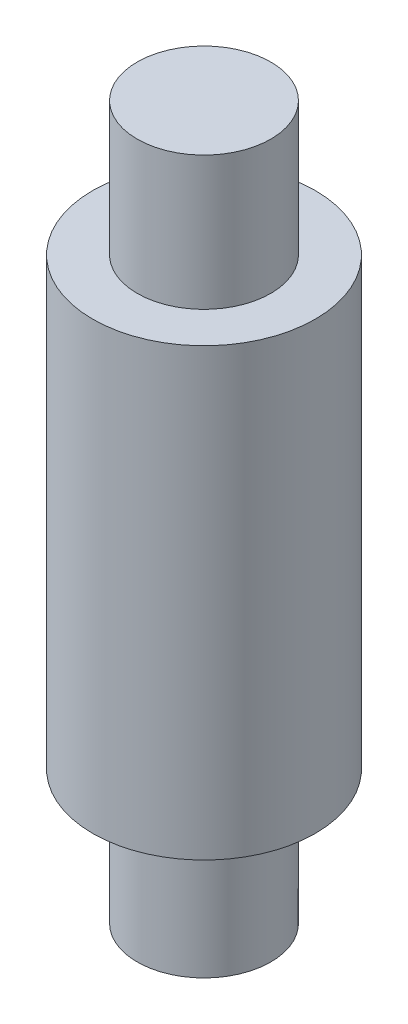
ISO-10303-21;
HEADER;
FILE_DESCRIPTION(('STEP AP214'),'2;1');
FILE_NAME('part.step','',(''),(''),'','','');
FILE_SCHEMA(('AUTOMOTIVE_DESIGN { 1 0 10303 214 1 1 1 1 }'));
ENDSEC;
DATA;
#1=APPLICATION_CONTEXT('core data for automotive mechanical design processes');
#2=APPLICATION_PROTOCOL_DEFINITION('international standard','automotive_design',2000,#1);
#3=PRODUCT_CONTEXT('',#1,'mechanical');
#4=PRODUCT('Part','Part','',(#3));
#5=PRODUCT_RELATED_PRODUCT_CATEGORY('part','',(#4));
#6=PRODUCT_DEFINITION_FORMATION('','',#4);
#7=PRODUCT_DEFINITION_CONTEXT('part definition',#1,'design');
#8=PRODUCT_DEFINITION('design','',#6,#7);
#9=PRODUCT_DEFINITION_SHAPE('','',#8);
#10=(LENGTH_UNIT() NAMED_UNIT(*) SI_UNIT(.MILLI.,.METRE.));
#11=(NAMED_UNIT(*) PLANE_ANGLE_UNIT() SI_UNIT($,.RADIAN.));
#12=(NAMED_UNIT(*) SI_UNIT($,.STERADIAN.) SOLID_ANGLE_UNIT());
#13=UNCERTAINTY_MEASURE_WITH_UNIT(LENGTH_MEASURE(1.E-05),#10,'distance_accuracy_value','');
#14=(GEOMETRIC_REPRESENTATION_CONTEXT(3) GLOBAL_UNCERTAINTY_ASSIGNED_CONTEXT((#13)) GLOBAL_UNIT_ASSIGNED_CONTEXT((#10,
#11,#12)) REPRESENTATION_CONTEXT('',''));
#15=CARTESIAN_POINT('',(0.,0.,0.));
#16=DIRECTION('',(0.,0.,1.));
#17=DIRECTION('',(1.,0.,0.));
#18=AXIS2_PLACEMENT_3D('',#15,#16,#17);
#19=CARTESIAN_POINT('',(0.,-5.,0.));
#20=DIRECTION('',(0.,1.,0.));
#21=DIRECTION('',(0.,0.,1.));
#22=AXIS2_PLACEMENT_3D('',#19,#20,#21);
#23=CYLINDRICAL_SURFACE('',#22,2.5);
#24=CARTESIAN_POINT('',(0.,-5.,0.));
#25=DIRECTION('',(0.,1.,0.));
#26=DIRECTION('',(0.,0.,1.));
#27=AXIS2_PLACEMENT_3D('',#24,#25,#26);
#28=CIRCLE('',#27,2.5);
#29=CARTESIAN_POINT('',(0.,-5.,2.5));
#30=VERTEX_POINT('',#29);
#31=EDGE_CURVE('E51',#30,#30,#28,.T.);
#32=ORIENTED_EDGE('',*,*,#31,.T.);
#33=EDGE_LOOP('',(#32));
#34=FACE_BOUND('',#33,.T.);
#35=CARTESIAN_POINT('',(0.,5.,0.));
#36=DIRECTION('',(0.,1.,0.));
#37=DIRECTION('',(0.,0.,1.));
#38=AXIS2_PLACEMENT_3D('',#35,#36,#37);
#39=CIRCLE('',#38,2.5);
#40=CARTESIAN_POINT('',(0.,5.,2.5));
#41=VERTEX_POINT('',#40);
#42=EDGE_CURVE('E42',#41,#41,#39,.T.);
#43=ORIENTED_EDGE('',*,*,#42,.F.);
#44=EDGE_LOOP('',(#43));
#45=FACE_BOUND('',#44,.T.);
#46=ADVANCED_FACE('F39',(#34,#45),#23,.T.);
#47=CARTESIAN_POINT('',(0.,-5.,0.));
#48=DIRECTION('',(0.,1.,0.));
#49=DIRECTION('',(0.,0.,1.));
#50=AXIS2_PLACEMENT_3D('',#47,#48,#49);
#51=PLANE('',#50);
#52=CARTESIAN_POINT('',(0.,-5.,0.));
#53=DIRECTION('',(0.,-1.,0.));
#54=DIRECTION('',(0.,0.,-1.));
#55=AXIS2_PLACEMENT_3D('',#52,#53,#54);
#56=CIRCLE('',#55,1.5);
#57=CARTESIAN_POINT('',(0.,-5.,-1.5));
#58=VERTEX_POINT('',#57);
#59=EDGE_CURVE('E10',#58,#58,#56,.T.);
#60=ORIENTED_EDGE('',*,*,#59,.F.);
#61=EDGE_LOOP('',(#60));
#62=FACE_BOUND('',#61,.T.);
#63=ORIENTED_EDGE('',*,*,#31,.F.);
#64=EDGE_LOOP('',(#63));
#65=FACE_BOUND('',#64,.T.);
#66=ADVANCED_FACE('F67',(#62,#65),#51,.F.);
#67=CARTESIAN_POINT('',(0.,5.,0.));
#68=DIRECTION('',(0.,1.,0.));
#69=DIRECTION('',(0.,0.,1.));
#70=AXIS2_PLACEMENT_3D('',#67,#68,#69);
#71=PLANE('',#70);
#72=CARTESIAN_POINT('',(0.,5.,0.));
#73=DIRECTION('',(0.,1.,0.));
#74=DIRECTION('',(0.,0.,1.));
#75=AXIS2_PLACEMENT_3D('',#72,#73,#74);
#76=CIRCLE('',#75,1.5);
#77=CARTESIAN_POINT('',(0.,5.,1.5));
#78=VERTEX_POINT('',#77);
#79=EDGE_CURVE('E46',#78,#78,#76,.T.);
#80=ORIENTED_EDGE('',*,*,#79,.F.);
#81=EDGE_LOOP('',(#80));
#82=FACE_BOUND('',#81,.T.);
#83=ORIENTED_EDGE('',*,*,#42,.T.);
#84=EDGE_LOOP('',(#83));
#85=FACE_BOUND('',#84,.T.);
#86=ADVANCED_FACE('F64',(#82,#85),#71,.T.);
#87=CARTESIAN_POINT('',(0.,8.,0.));
#88=DIRECTION('',(0.,-1.,0.));
#89=DIRECTION('',(0.,0.,-1.));
#90=AXIS2_PLACEMENT_3D('',#87,#88,#89);
#91=CYLINDRICAL_SURFACE('',#90,1.5);
#92=CARTESIAN_POINT('',(0.,8.,0.));
#93=DIRECTION('',(0.,1.,0.));
#94=DIRECTION('',(0.,0.,1.));
#95=AXIS2_PLACEMENT_3D('',#92,#93,#94);
#96=CIRCLE('',#95,1.5);
#97=CARTESIAN_POINT('',(0.,8.,1.5));
#98=VERTEX_POINT('',#97);
#99=EDGE_CURVE('E56',#98,#98,#96,.T.);
#100=ORIENTED_EDGE('',*,*,#99,.F.);
#101=EDGE_LOOP('',(#100));
#102=FACE_BOUND('',#101,.T.);
#103=ORIENTED_EDGE('',*,*,#79,.T.);
#104=EDGE_LOOP('',(#103));
#105=FACE_BOUND('',#104,.T.);
#106=ADVANCED_FACE('F76',(#102,#105),#91,.T.);
#107=CARTESIAN_POINT('',(0.,8.,0.));
#108=DIRECTION('',(0.,1.,0.));
#109=DIRECTION('',(0.,0.,1.));
#110=AXIS2_PLACEMENT_3D('',#107,#108,#109);
#111=PLANE('',#110);
#112=ORIENTED_EDGE('',*,*,#99,.T.);
#113=EDGE_LOOP('',(#112));
#114=FACE_BOUND('',#113,.T.);
#115=ADVANCED_FACE('F82',(#114),#111,.T.);
#116=CARTESIAN_POINT('',(0.,-8.,0.));
#117=DIRECTION('',(0.,1.,0.));
#118=DIRECTION('',(0.,0.,1.));
#119=AXIS2_PLACEMENT_3D('',#116,#117,#118);
#120=CYLINDRICAL_SURFACE('',#119,1.5);
#121=CARTESIAN_POINT('',(0.,-8.,0.));
#122=DIRECTION('',(0.,-1.,0.));
#123=DIRECTION('',(0.,0.,-1.));
#124=AXIS2_PLACEMENT_3D('',#121,#122,#123);
#125=CIRCLE('',#124,1.5);
#126=CARTESIAN_POINT('',(0.,-8.,-1.5));
#127=VERTEX_POINT('',#126);
#128=EDGE_CURVE('E55',#127,#127,#125,.T.);
#129=ORIENTED_EDGE('',*,*,#128,.F.);
#130=EDGE_LOOP('',(#129));
#131=FACE_BOUND('',#130,.T.);
#132=ORIENTED_EDGE('',*,*,#59,.T.);
#133=EDGE_LOOP('',(#132));
#134=FACE_BOUND('',#133,.T.);
#135=ADVANCED_FACE('F86',(#131,#134),#120,.T.);
#136=CARTESIAN_POINT('',(0.,-8.,0.));
#137=DIRECTION('',(0.,-1.,0.));
#138=DIRECTION('',(0.,0.,-1.));
#139=AXIS2_PLACEMENT_3D('',#136,#137,#138);
#140=PLANE('',#139);
#141=ORIENTED_EDGE('',*,*,#128,.T.);
#142=EDGE_LOOP('',(#141));
#143=FACE_BOUND('',#142,.T.);
#144=ADVANCED_FACE('F90',(#143),#140,.T.);
#145=CLOSED_SHELL('',(#46,#66,#86,#106,#115,#135,#144));
#146=MANIFOLD_SOLID_BREP('B2',#145);
#147=ADVANCED_BREP_SHAPE_REPRESENTATION('',(#18,#146),#14);
#148=SHAPE_DEFINITION_REPRESENTATION(#9,#147);
ENDSEC;
END-ISO-10303-21;
